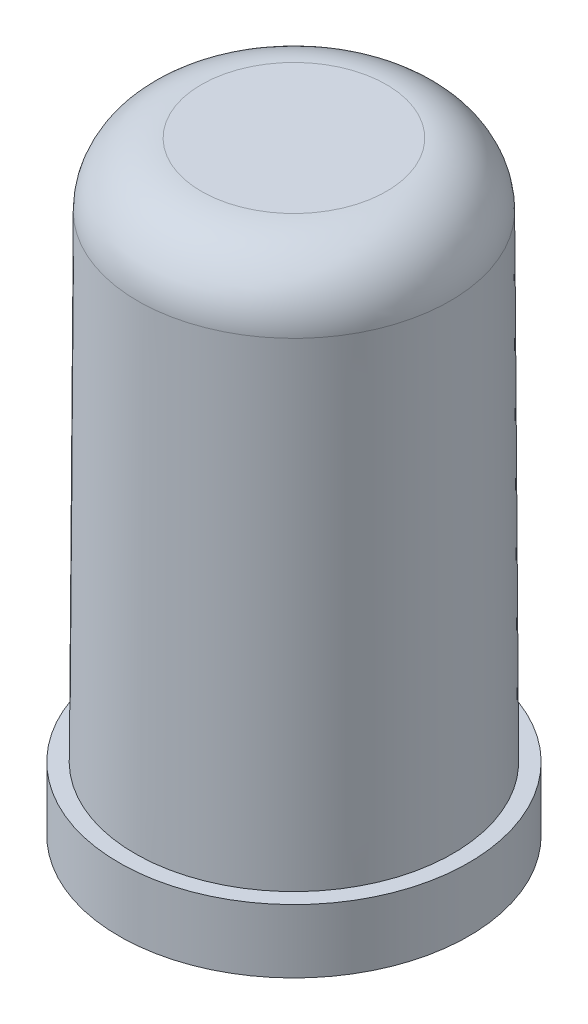
ISO-10303-21;
HEADER;
FILE_DESCRIPTION(('STEP AP214'),'2;1');
FILE_NAME('part.step','',(''),(''),'','','');
FILE_SCHEMA(('AUTOMOTIVE_DESIGN { 1 0 10303 214 1 1 1 1 }'));
ENDSEC;
DATA;
#1=APPLICATION_CONTEXT('core data for automotive mechanical design processes');
#2=APPLICATION_PROTOCOL_DEFINITION('international standard','automotive_design',2000,#1);
#3=PRODUCT_CONTEXT('',#1,'mechanical');
#4=PRODUCT('Part','Part','',(#3));
#5=PRODUCT_RELATED_PRODUCT_CATEGORY('part','',(#4));
#6=PRODUCT_DEFINITION_FORMATION('','',#4);
#7=PRODUCT_DEFINITION_CONTEXT('part definition',#1,'design');
#8=PRODUCT_DEFINITION('design','',#6,#7);
#9=PRODUCT_DEFINITION_SHAPE('','',#8);
#10=(LENGTH_UNIT() NAMED_UNIT(*) SI_UNIT(.MILLI.,.METRE.));
#11=(NAMED_UNIT(*) PLANE_ANGLE_UNIT() SI_UNIT($,.RADIAN.));
#12=(NAMED_UNIT(*) SI_UNIT($,.STERADIAN.) SOLID_ANGLE_UNIT());
#13=UNCERTAINTY_MEASURE_WITH_UNIT(LENGTH_MEASURE(1.E-05),#10,'distance_accuracy_value','');
#14=(GEOMETRIC_REPRESENTATION_CONTEXT(3) GLOBAL_UNCERTAINTY_ASSIGNED_CONTEXT((#13)) GLOBAL_UNIT_ASSIGNED_CONTEXT((#10,
#11,#12)) REPRESENTATION_CONTEXT('',''));
#15=CARTESIAN_POINT('',(0.,0.,0.));
#16=DIRECTION('',(0.,0.,1.));
#17=DIRECTION('',(1.,0.,0.));
#18=AXIS2_PLACEMENT_3D('',#15,#16,#17);
#19=CARTESIAN_POINT('',(-4.9,19.,0.));
#20=DIRECTION('',(0.,1.,0.));
#21=DIRECTION('',(-1.,0.,0.));
#22=AXIS2_PLACEMENT_3D('',#19,#20,#21);
#23=PLANE('',#22);
#24=CARTESIAN_POINT('',(0.,19.,0.));
#25=DIRECTION('',(0.,1.,0.));
#26=DIRECTION('',(-1.,0.,0.));
#27=AXIS2_PLACEMENT_3D('',#24,#25,#26);
#28=CIRCLE('',#27,2.91173010410555);
#29=CARTESIAN_POINT('',(-2.91173010410555,19.,0.));
#30=VERTEX_POINT('',#29);
#31=EDGE_CURVE('E40',#30,#30,#28,.T.);
#32=ORIENTED_EDGE('',*,*,#31,.T.);
#33=EDGE_LOOP('',(#32));
#34=FACE_BOUND('',#33,.T.);
#35=ADVANCED_FACE('F33',(#34),#23,.T.);
#36=CARTESIAN_POINT('',(0.,17.,0.));
#37=DIRECTION('',(0.,-1.,0.));
#38=DIRECTION('',(1.,0.,0.));
#39=AXIS2_PLACEMENT_3D('',#36,#37,#38);
#40=PLANE('',#39);
#41=CARTESIAN_POINT('',(0.,17.,0.));
#42=DIRECTION('',(0.,-1.,0.));
#43=DIRECTION('',(1.,0.,0.));
#44=AXIS2_PLACEMENT_3D('',#41,#42,#43);
#45=CIRCLE('',#44,1.04);
#46=CARTESIAN_POINT('',(1.04,17.,0.));
#47=VERTEX_POINT('',#46);
#48=EDGE_CURVE('E44',#47,#47,#45,.T.);
#49=ORIENTED_EDGE('',*,*,#48,.T.);
#50=EDGE_LOOP('',(#49));
#51=FACE_BOUND('',#50,.T.);
#52=ADVANCED_FACE('F83',(#51),#40,.T.);
#53=CARTESIAN_POINT('',(0.,19.,0.));
#54=DIRECTION('',(0.,1.,0.));
#55=DIRECTION('',(-1.,0.,0.));
#56=AXIS2_PLACEMENT_3D('',#53,#54,#55);
#57=CYLINDRICAL_SURFACE('',#56,3.04);
#58=CARTESIAN_POINT('',(0.,15.,0.));
#59=DIRECTION('',(0.,-1.,0.));
#60=DIRECTION('',(1.,0.,0.));
#61=AXIS2_PLACEMENT_3D('',#58,#59,#60);
#62=CIRCLE('',#61,3.04);
#63=CARTESIAN_POINT('',(3.04,15.,0.));
#64=VERTEX_POINT('',#63);
#65=EDGE_CURVE('E48',#64,#64,#62,.F.);
#66=ORIENTED_EDGE('',*,*,#65,.T.);
#67=EDGE_LOOP('',(#66));
#68=FACE_BOUND('',#67,.T.);
#69=CARTESIAN_POINT('',(0.,0.,0.));
#70=DIRECTION('',(0.,1.,0.));
#71=DIRECTION('',(-1.,0.,0.));
#72=AXIS2_PLACEMENT_3D('',#69,#70,#71);
#73=CIRCLE('',#72,3.04);
#74=CARTESIAN_POINT('',(-3.04,0.,0.));
#75=VERTEX_POINT('',#74);
#76=EDGE_CURVE('E53',#75,#75,#73,.T.);
#77=ORIENTED_EDGE('',*,*,#76,.F.);
#78=EDGE_LOOP('',(#77));
#79=FACE_BOUND('',#78,.T.);
#80=ADVANCED_FACE('F88',(#68,#79),#57,.F.);
#81=CARTESIAN_POINT('',(-3.04,0.,0.));
#82=DIRECTION('',(0.,-1.,0.));
#83=DIRECTION('',(1.,0.,0.));
#84=AXIS2_PLACEMENT_3D('',#81,#82,#83);
#85=PLANE('',#84);
#86=ORIENTED_EDGE('',*,*,#76,.T.);
#87=EDGE_LOOP('',(#86));
#88=FACE_BOUND('',#87,.T.);
#89=CARTESIAN_POINT('',(0.,0.,0.));
#90=DIRECTION('',(0.,1.,0.));
#91=DIRECTION('',(-1.,0.,0.));
#92=AXIS2_PLACEMENT_3D('',#89,#90,#91);
#93=CIRCLE('',#92,5.5);
#94=CARTESIAN_POINT('',(-5.5,0.,0.));
#95=VERTEX_POINT('',#94);
#96=EDGE_CURVE('E56',#95,#95,#93,.T.);
#97=ORIENTED_EDGE('',*,*,#96,.F.);
#98=EDGE_LOOP('',(#97));
#99=FACE_BOUND('',#98,.T.);
#100=ADVANCED_FACE('F79',(#88,#99),#85,.T.);
#101=CARTESIAN_POINT('',(0.,19.,0.));
#102=DIRECTION('',(0.,1.,0.));
#103=DIRECTION('',(-1.,0.,0.));
#104=AXIS2_PLACEMENT_3D('',#101,#102,#103);
#105=CYLINDRICAL_SURFACE('',#104,5.5);
#106=ORIENTED_EDGE('',*,*,#96,.T.);
#107=EDGE_LOOP('',(#106));
#108=FACE_BOUND('',#107,.T.);
#109=CARTESIAN_POINT('',(0.,2.,0.));
#110=DIRECTION('',(0.,1.,0.));
#111=DIRECTION('',(-1.,0.,0.));
#112=AXIS2_PLACEMENT_3D('',#109,#110,#111);
#113=CIRCLE('',#112,5.5);
#114=CARTESIAN_POINT('',(-5.5,2.,0.));
#115=VERTEX_POINT('',#114);
#116=EDGE_CURVE('E59',#115,#115,#113,.T.);
#117=ORIENTED_EDGE('',*,*,#116,.F.);
#118=EDGE_LOOP('',(#117));
#119=FACE_BOUND('',#118,.T.);
#120=ADVANCED_FACE('F70',(#108,#119),#105,.T.);
#121=CARTESIAN_POINT('',(-5.5,2.,0.));
#122=DIRECTION('',(0.,1.,0.));
#123=DIRECTION('',(-1.,0.,0.));
#124=AXIS2_PLACEMENT_3D('',#121,#122,#123);
#125=PLANE('',#124);
#126=ORIENTED_EDGE('',*,*,#116,.T.);
#127=EDGE_LOOP('',(#126));
#128=FACE_BOUND('',#127,.T.);
#129=CARTESIAN_POINT('',(0.,2.,0.));
#130=DIRECTION('',(0.,1.,0.));
#131=DIRECTION('',(-1.,0.,0.));
#132=AXIS2_PLACEMENT_3D('',#129,#130,#131);
#133=CIRCLE('',#132,5.);
#134=CARTESIAN_POINT('',(-5.,2.,0.));
#135=VERTEX_POINT('',#134);
#136=EDGE_CURVE('E62',#135,#135,#133,.T.);
#137=ORIENTED_EDGE('',*,*,#136,.F.);
#138=EDGE_LOOP('',(#137));
#139=FACE_BOUND('',#138,.T.);
#140=ADVANCED_FACE('F68',(#128,#139),#125,.T.);
#141=CARTESIAN_POINT('',(0.,19.,0.));
#142=DIRECTION('',(0.,-1.,0.));
#143=DIRECTION('',(1.,0.,0.));
#144=AXIS2_PLACEMENT_3D('',#141,#142,#143);
#145=CONICAL_SURFACE('',#144,4.9,0.00588228509537691);
#146=CARTESIAN_POINT('',(0.,17.0117645023462,0.));
#147=DIRECTION('',(0.,1.,0.));
#148=DIRECTION('',(-1.,0.,0.));
#149=AXIS2_PLACEMENT_3D('',#146,#147,#148);
#150=CIRCLE('',#149,4.91169550292738);
#151=CARTESIAN_POINT('',(-4.91169550292738,17.0117645023462,0.));
#152=VERTEX_POINT('',#151);
#153=EDGE_CURVE('E10',#152,#152,#150,.F.);
#154=ORIENTED_EDGE('',*,*,#153,.T.);
#155=EDGE_LOOP('',(#154));
#156=FACE_BOUND('',#155,.T.);
#157=ORIENTED_EDGE('',*,*,#136,.T.);
#158=EDGE_LOOP('',(#157));
#159=FACE_BOUND('',#158,.T.);
#160=ADVANCED_FACE('F66',(#156,#159),#145,.T.);
#161=CARTESIAN_POINT('',(0.,15.,0.));
#162=DIRECTION('',(0.,-1.,0.));
#163=DIRECTION('',(1.,0.,0.));
#164=AXIS2_PLACEMENT_3D('',#161,#162,#163);
#165=DEGENERATE_TOROIDAL_SURFACE('',#164,1.04,2.,.T.);
#166=ORIENTED_EDGE('',*,*,#48,.F.);
#167=EDGE_LOOP('',(#166));
#168=FACE_BOUND('',#167,.T.);
#169=ORIENTED_EDGE('',*,*,#65,.F.);
#170=EDGE_LOOP('',(#169));
#171=FACE_BOUND('',#170,.T.);
#172=ADVANCED_FACE('F77',(#168,#171),#165,.F.);
#173=CARTESIAN_POINT('',(0.,17.,0.));
#174=DIRECTION('',(0.,1.,0.));
#175=DIRECTION('',(-1.,0.,0.));
#176=AXIS2_PLACEMENT_3D('',#173,#174,#175);
#177=TOROIDAL_SURFACE('',#176,2.91173010410555,2.);
#178=ORIENTED_EDGE('',*,*,#153,.F.);
#179=EDGE_LOOP('',(#178));
#180=FACE_BOUND('',#179,.T.);
#181=ORIENTED_EDGE('',*,*,#31,.F.);
#182=EDGE_LOOP('',(#181));
#183=FACE_BOUND('',#182,.T.);
#184=ADVANCED_FACE('F35',(#180,#183),#177,.T.);
#185=CLOSED_SHELL('',(#35,#52,#80,#100,#120,#140,#160,#172,#184));
#186=MANIFOLD_SOLID_BREP('B2',#185);
#187=ADVANCED_BREP_SHAPE_REPRESENTATION('',(#18,#186),#14);
#188=SHAPE_DEFINITION_REPRESENTATION(#9,#187);
ENDSEC;
END-ISO-10303-21;
